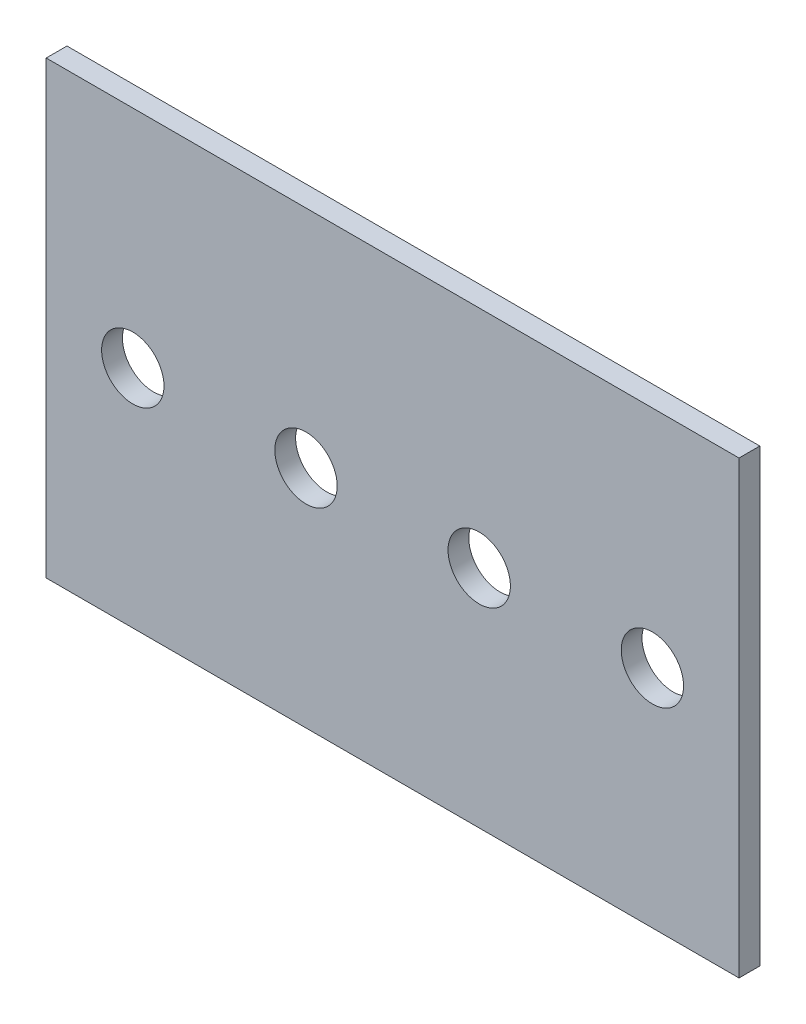
ISO-10303-21;
HEADER;
FILE_DESCRIPTION(('STEP AP214'),'2;1');
FILE_NAME('part.step','',(''),(''),'','','');
FILE_SCHEMA(('AUTOMOTIVE_DESIGN { 1 0 10303 214 1 1 1 1 }'));
ENDSEC;
DATA;
#1=APPLICATION_CONTEXT('core data for automotive mechanical design processes');
#2=APPLICATION_PROTOCOL_DEFINITION('international standard','automotive_design',2000,#1);
#3=PRODUCT_CONTEXT('',#1,'mechanical');
#4=PRODUCT('Part','Part','',(#3));
#5=PRODUCT_RELATED_PRODUCT_CATEGORY('part','',(#4));
#6=PRODUCT_DEFINITION_FORMATION('','',#4);
#7=PRODUCT_DEFINITION_CONTEXT('part definition',#1,'design');
#8=PRODUCT_DEFINITION('design','',#6,#7);
#9=PRODUCT_DEFINITION_SHAPE('','',#8);
#10=(LENGTH_UNIT() NAMED_UNIT(*) SI_UNIT(.MILLI.,.METRE.));
#11=(NAMED_UNIT(*) PLANE_ANGLE_UNIT() SI_UNIT($,.RADIAN.));
#12=(NAMED_UNIT(*) SI_UNIT($,.STERADIAN.) SOLID_ANGLE_UNIT());
#13=UNCERTAINTY_MEASURE_WITH_UNIT(LENGTH_MEASURE(1.E-05),#10,'distance_accuracy_value','');
#14=(GEOMETRIC_REPRESENTATION_CONTEXT(3) GLOBAL_UNCERTAINTY_ASSIGNED_CONTEXT((#13)) GLOBAL_UNIT_ASSIGNED_CONTEXT((#10,
#11,#12)) REPRESENTATION_CONTEXT('',''));
#15=CARTESIAN_POINT('',(0.,0.,0.));
#16=DIRECTION('',(0.,0.,1.));
#17=DIRECTION('',(1.,0.,0.));
#18=AXIS2_PLACEMENT_3D('',#15,#16,#17);
#19=CARTESIAN_POINT('',(0.,0.,-6.));
#20=DIRECTION('',(-1.,0.,0.));
#21=DIRECTION('',(0.,0.,1.));
#22=AXIS2_PLACEMENT_3D('',#19,#20,#21);
#23=PLANE('',#22);
#24=DIRECTION('',(0.,-1.,0.));
#25=VECTOR('',#24,1.);
#26=CARTESIAN_POINT('',(0.,0.,0.));
#27=LINE('',#26,#25);
#28=CARTESIAN_POINT('',(0.,0.,0.));
#29=VERTEX_POINT('',#28);
#30=CARTESIAN_POINT('',(0.,-130.,0.));
#31=VERTEX_POINT('',#30);
#32=EDGE_CURVE('E101',#29,#31,#27,.T.);
#33=ORIENTED_EDGE('',*,*,#32,.F.);
#34=DIRECTION('',(0.,0.,1.));
#35=VECTOR('',#34,1.);
#36=CARTESIAN_POINT('',(0.,0.,-6.));
#37=LINE('',#36,#35);
#38=CARTESIAN_POINT('',(0.,0.,-6.));
#39=VERTEX_POINT('',#38);
#40=EDGE_CURVE('E11',#39,#29,#37,.T.);
#41=ORIENTED_EDGE('',*,*,#40,.F.);
#42=DIRECTION('',(0.,-1.,0.));
#43=VECTOR('',#42,1.);
#44=CARTESIAN_POINT('',(0.,0.,-6.));
#45=LINE('',#44,#43);
#46=CARTESIAN_POINT('',(0.,-130.,-6.));
#47=VERTEX_POINT('',#46);
#48=EDGE_CURVE('E94',#39,#47,#45,.T.);
#49=ORIENTED_EDGE('',*,*,#48,.T.);
#50=DIRECTION('',(0.,0.,1.));
#51=VECTOR('',#50,1.);
#52=CARTESIAN_POINT('',(0.,-130.,-6.));
#53=LINE('',#52,#51);
#54=EDGE_CURVE('E39',#47,#31,#53,.T.);
#55=ORIENTED_EDGE('',*,*,#54,.T.);
#56=EDGE_LOOP('',(#33,#41,#49,#55));
#57=FACE_BOUND('',#56,.T.);
#58=ADVANCED_FACE('F36',(#57),#23,.T.);
#59=CARTESIAN_POINT('',(0.,0.,-6.));
#60=DIRECTION('',(0.,1.,0.));
#61=DIRECTION('',(0.,0.,1.));
#62=AXIS2_PLACEMENT_3D('',#59,#60,#61);
#63=PLANE('',#62);
#64=DIRECTION('',(-1.,0.,0.));
#65=VECTOR('',#64,1.);
#66=CARTESIAN_POINT('',(0.,0.,0.));
#67=LINE('',#66,#65);
#68=CARTESIAN_POINT('',(200.,0.,0.));
#69=VERTEX_POINT('',#68);
#70=EDGE_CURVE('E96',#69,#29,#67,.T.);
#71=ORIENTED_EDGE('',*,*,#70,.F.);
#72=DIRECTION('',(0.,0.,1.));
#73=VECTOR('',#72,1.);
#74=CARTESIAN_POINT('',(200.,0.,-6.));
#75=LINE('',#74,#73);
#76=CARTESIAN_POINT('',(200.,0.,-6.));
#77=VERTEX_POINT('',#76);
#78=EDGE_CURVE('E45',#77,#69,#75,.T.);
#79=ORIENTED_EDGE('',*,*,#78,.F.);
#80=DIRECTION('',(-1.,0.,0.));
#81=VECTOR('',#80,1.);
#82=CARTESIAN_POINT('',(0.,0.,-6.));
#83=LINE('',#82,#81);
#84=EDGE_CURVE('E91',#77,#39,#83,.T.);
#85=ORIENTED_EDGE('',*,*,#84,.T.);
#86=ORIENTED_EDGE('',*,*,#40,.T.);
#87=EDGE_LOOP('',(#71,#79,#85,#86));
#88=FACE_BOUND('',#87,.T.);
#89=ADVANCED_FACE('F112',(#88),#63,.T.);
#90=CARTESIAN_POINT('',(200.,0.,-6.));
#91=DIRECTION('',(1.,0.,0.));
#92=DIRECTION('',(0.,0.,-1.));
#93=AXIS2_PLACEMENT_3D('',#90,#91,#92);
#94=PLANE('',#93);
#95=DIRECTION('',(0.,1.,0.));
#96=VECTOR('',#95,1.);
#97=CARTESIAN_POINT('',(200.,0.,0.));
#98=LINE('',#97,#96);
#99=CARTESIAN_POINT('',(200.,-130.,0.));
#100=VERTEX_POINT('',#99);
#101=EDGE_CURVE('E86',#100,#69,#98,.T.);
#102=ORIENTED_EDGE('',*,*,#101,.F.);
#103=DIRECTION('',(0.,0.,1.));
#104=VECTOR('',#103,1.);
#105=CARTESIAN_POINT('',(200.,-130.,-6.));
#106=LINE('',#105,#104);
#107=CARTESIAN_POINT('',(200.,-130.,-6.));
#108=VERTEX_POINT('',#107);
#109=EDGE_CURVE('E81',#108,#100,#106,.T.);
#110=ORIENTED_EDGE('',*,*,#109,.F.);
#111=DIRECTION('',(0.,1.,0.));
#112=VECTOR('',#111,1.);
#113=CARTESIAN_POINT('',(200.,0.,-6.));
#114=LINE('',#113,#112);
#115=EDGE_CURVE('E84',#108,#77,#114,.T.);
#116=ORIENTED_EDGE('',*,*,#115,.T.);
#117=ORIENTED_EDGE('',*,*,#78,.T.);
#118=EDGE_LOOP('',(#102,#110,#116,#117));
#119=FACE_BOUND('',#118,.T.);
#120=ADVANCED_FACE('F83',(#119),#94,.T.);
#121=CARTESIAN_POINT('',(0.,-130.,-6.));
#122=DIRECTION('',(0.,-1.,0.));
#123=DIRECTION('',(0.,0.,-1.));
#124=AXIS2_PLACEMENT_3D('',#121,#122,#123);
#125=PLANE('',#124);
#126=DIRECTION('',(1.,0.,0.));
#127=VECTOR('',#126,1.);
#128=CARTESIAN_POINT('',(0.,-130.,0.));
#129=LINE('',#128,#127);
#130=EDGE_CURVE('E104',#31,#100,#129,.T.);
#131=ORIENTED_EDGE('',*,*,#130,.F.);
#132=ORIENTED_EDGE('',*,*,#54,.F.);
#133=DIRECTION('',(1.,0.,0.));
#134=VECTOR('',#133,1.);
#135=CARTESIAN_POINT('',(0.,-130.,-6.));
#136=LINE('',#135,#134);
#137=EDGE_CURVE('E90',#47,#108,#136,.T.);
#138=ORIENTED_EDGE('',*,*,#137,.T.);
#139=ORIENTED_EDGE('',*,*,#109,.T.);
#140=EDGE_LOOP('',(#131,#132,#138,#139));
#141=FACE_BOUND('',#140,.T.);
#142=ADVANCED_FACE('F93',(#141),#125,.T.);
#143=CARTESIAN_POINT('',(0.,0.,-6.));
#144=DIRECTION('',(0.,0.,1.));
#145=DIRECTION('',(1.,0.,0.));
#146=AXIS2_PLACEMENT_3D('',#143,#144,#145);
#147=PLANE('',#146);
#148=CARTESIAN_POINT('',(175.,-65.0000000000004,-6.));
#149=DIRECTION('',(0.,0.,1.));
#150=DIRECTION('',(-1.,0.,0.));
#151=AXIS2_PLACEMENT_3D('',#148,#149,#150);
#152=CIRCLE('',#151,9.00000000000001);
#153=CARTESIAN_POINT('',(166.,-65.0000000000004,-6.));
#154=VERTEX_POINT('',#153);
#155=EDGE_CURVE('E153',#154,#154,#152,.T.);
#156=ORIENTED_EDGE('',*,*,#155,.T.);
#157=EDGE_LOOP('',(#156));
#158=FACE_BOUND('',#157,.T.);
#159=CARTESIAN_POINT('',(125.,-65.,-6.));
#160=DIRECTION('',(0.,0.,1.));
#161=DIRECTION('',(-1.,0.,0.));
#162=AXIS2_PLACEMENT_3D('',#159,#160,#161);
#163=CIRCLE('',#162,9.00000000000001);
#164=CARTESIAN_POINT('',(116.,-65.,-6.));
#165=VERTEX_POINT('',#164);
#166=EDGE_CURVE('E161',#165,#165,#163,.T.);
#167=ORIENTED_EDGE('',*,*,#166,.T.);
#168=EDGE_LOOP('',(#167));
#169=FACE_BOUND('',#168,.T.);
#170=CARTESIAN_POINT('',(25.,-65.0000000000004,-6.));
#171=DIRECTION('',(0.,0.,1.));
#172=DIRECTION('',(1.,0.,0.));
#173=AXIS2_PLACEMENT_3D('',#170,#171,#172);
#174=CIRCLE('',#173,9.);
#175=CARTESIAN_POINT('',(34.,-65.0000000000004,-6.));
#176=VERTEX_POINT('',#175);
#177=EDGE_CURVE('E167',#176,#176,#174,.T.);
#178=ORIENTED_EDGE('',*,*,#177,.T.);
#179=EDGE_LOOP('',(#178));
#180=FACE_BOUND('',#179,.T.);
#181=CARTESIAN_POINT('',(75.,-65.,-6.));
#182=DIRECTION('',(0.,0.,1.));
#183=DIRECTION('',(1.,0.,0.));
#184=AXIS2_PLACEMENT_3D('',#181,#182,#183);
#185=CIRCLE('',#184,9.);
#186=CARTESIAN_POINT('',(84.,-65.,-6.));
#187=VERTEX_POINT('',#186);
#188=EDGE_CURVE('E105',#187,#187,#185,.T.);
#189=ORIENTED_EDGE('',*,*,#188,.T.);
#190=EDGE_LOOP('',(#189));
#191=FACE_BOUND('',#190,.T.);
#192=ORIENTED_EDGE('',*,*,#48,.F.);
#193=ORIENTED_EDGE('',*,*,#84,.F.);
#194=ORIENTED_EDGE('',*,*,#115,.F.);
#195=ORIENTED_EDGE('',*,*,#137,.F.);
#196=EDGE_LOOP('',(#192,#193,#194,#195));
#197=FACE_BOUND('',#196,.T.);
#198=ADVANCED_FACE('F89',(#158,#169,#180,#191,#197),#147,.F.);
#199=CARTESIAN_POINT('',(0.,0.,0.));
#200=DIRECTION('',(0.,0.,1.));
#201=DIRECTION('',(1.,0.,0.));
#202=AXIS2_PLACEMENT_3D('',#199,#200,#201);
#203=PLANE('',#202);
#204=CARTESIAN_POINT('',(175.,-65.0000000000004,0.));
#205=DIRECTION('',(0.,0.,1.));
#206=DIRECTION('',(-1.,0.,0.));
#207=AXIS2_PLACEMENT_3D('',#204,#205,#206);
#208=CIRCLE('',#207,9.00000000000001);
#209=CARTESIAN_POINT('',(166.,-65.0000000000004,0.));
#210=VERTEX_POINT('',#209);
#211=EDGE_CURVE('E156',#210,#210,#208,.T.);
#212=ORIENTED_EDGE('',*,*,#211,.F.);
#213=EDGE_LOOP('',(#212));
#214=FACE_BOUND('',#213,.T.);
#215=CARTESIAN_POINT('',(125.,-65.,0.));
#216=DIRECTION('',(0.,0.,1.));
#217=DIRECTION('',(-1.,0.,0.));
#218=AXIS2_PLACEMENT_3D('',#215,#216,#217);
#219=CIRCLE('',#218,9.00000000000001);
#220=CARTESIAN_POINT('',(116.,-65.,0.));
#221=VERTEX_POINT('',#220);
#222=EDGE_CURVE('E158',#221,#221,#219,.T.);
#223=ORIENTED_EDGE('',*,*,#222,.F.);
#224=EDGE_LOOP('',(#223));
#225=FACE_BOUND('',#224,.T.);
#226=CARTESIAN_POINT('',(25.,-65.0000000000004,0.));
#227=DIRECTION('',(0.,0.,1.));
#228=DIRECTION('',(1.,0.,0.));
#229=AXIS2_PLACEMENT_3D('',#226,#227,#228);
#230=CIRCLE('',#229,9.);
#231=CARTESIAN_POINT('',(34.,-65.0000000000004,0.));
#232=VERTEX_POINT('',#231);
#233=EDGE_CURVE('E164',#232,#232,#230,.T.);
#234=ORIENTED_EDGE('',*,*,#233,.F.);
#235=EDGE_LOOP('',(#234));
#236=FACE_BOUND('',#235,.T.);
#237=CARTESIAN_POINT('',(75.,-65.,0.));
#238=DIRECTION('',(0.,0.,1.));
#239=DIRECTION('',(1.,0.,0.));
#240=AXIS2_PLACEMENT_3D('',#237,#238,#239);
#241=CIRCLE('',#240,9.);
#242=CARTESIAN_POINT('',(84.,-65.,0.));
#243=VERTEX_POINT('',#242);
#244=EDGE_CURVE('E170',#243,#243,#241,.T.);
#245=ORIENTED_EDGE('',*,*,#244,.F.);
#246=EDGE_LOOP('',(#245));
#247=FACE_BOUND('',#246,.T.);
#248=ORIENTED_EDGE('',*,*,#32,.T.);
#249=ORIENTED_EDGE('',*,*,#130,.T.);
#250=ORIENTED_EDGE('',*,*,#101,.T.);
#251=ORIENTED_EDGE('',*,*,#70,.T.);
#252=EDGE_LOOP('',(#248,#249,#250,#251));
#253=FACE_BOUND('',#252,.T.);
#254=ADVANCED_FACE('F111',(#214,#225,#236,#247,#253),#203,.T.);
#255=CARTESIAN_POINT('',(75.,-65.,-6.));
#256=DIRECTION('',(0.,0.,1.));
#257=DIRECTION('',(1.,0.,0.));
#258=AXIS2_PLACEMENT_3D('',#255,#256,#257);
#259=CYLINDRICAL_SURFACE('',#258,9.);
#260=ORIENTED_EDGE('',*,*,#188,.F.);
#261=EDGE_LOOP('',(#260));
#262=FACE_BOUND('',#261,.T.);
#263=ORIENTED_EDGE('',*,*,#244,.T.);
#264=EDGE_LOOP('',(#263));
#265=FACE_BOUND('',#264,.T.);
#266=ADVANCED_FACE('F130',(#262,#265),#259,.F.);
#267=CARTESIAN_POINT('',(25.,-65.0000000000004,-6.));
#268=DIRECTION('',(0.,0.,1.));
#269=DIRECTION('',(1.,0.,0.));
#270=AXIS2_PLACEMENT_3D('',#267,#268,#269);
#271=CYLINDRICAL_SURFACE('',#270,9.);
#272=ORIENTED_EDGE('',*,*,#177,.F.);
#273=EDGE_LOOP('',(#272));
#274=FACE_BOUND('',#273,.T.);
#275=ORIENTED_EDGE('',*,*,#233,.T.);
#276=EDGE_LOOP('',(#275));
#277=FACE_BOUND('',#276,.T.);
#278=ADVANCED_FACE('F137',(#274,#277),#271,.F.);
#279=CARTESIAN_POINT('',(125.,-65.,-6.));
#280=DIRECTION('',(0.,0.,1.));
#281=DIRECTION('',(1.,0.,0.));
#282=AXIS2_PLACEMENT_3D('',#279,#280,#281);
#283=CYLINDRICAL_SURFACE('',#282,9.00000000000001);
#284=ORIENTED_EDGE('',*,*,#166,.F.);
#285=EDGE_LOOP('',(#284));
#286=FACE_BOUND('',#285,.T.);
#287=ORIENTED_EDGE('',*,*,#222,.T.);
#288=EDGE_LOOP('',(#287));
#289=FACE_BOUND('',#288,.T.);
#290=ADVANCED_FACE('F141',(#286,#289),#283,.F.);
#291=CARTESIAN_POINT('',(175.,-65.0000000000004,-6.));
#292=DIRECTION('',(0.,0.,1.));
#293=DIRECTION('',(1.,0.,0.));
#294=AXIS2_PLACEMENT_3D('',#291,#292,#293);
#295=CYLINDRICAL_SURFACE('',#294,9.00000000000001);
#296=ORIENTED_EDGE('',*,*,#155,.F.);
#297=EDGE_LOOP('',(#296));
#298=FACE_BOUND('',#297,.T.);
#299=ORIENTED_EDGE('',*,*,#211,.T.);
#300=EDGE_LOOP('',(#299));
#301=FACE_BOUND('',#300,.T.);
#302=ADVANCED_FACE('F145',(#298,#301),#295,.F.);
#303=CLOSED_SHELL('',(#58,#89,#120,#142,#198,#254,#266,#278,#290,#302));
#304=MANIFOLD_SOLID_BREP('B2',#303);
#305=ADVANCED_BREP_SHAPE_REPRESENTATION('',(#18,#304),#14);
#306=SHAPE_DEFINITION_REPRESENTATION(#9,#305);
ENDSEC;
END-ISO-10303-21;
